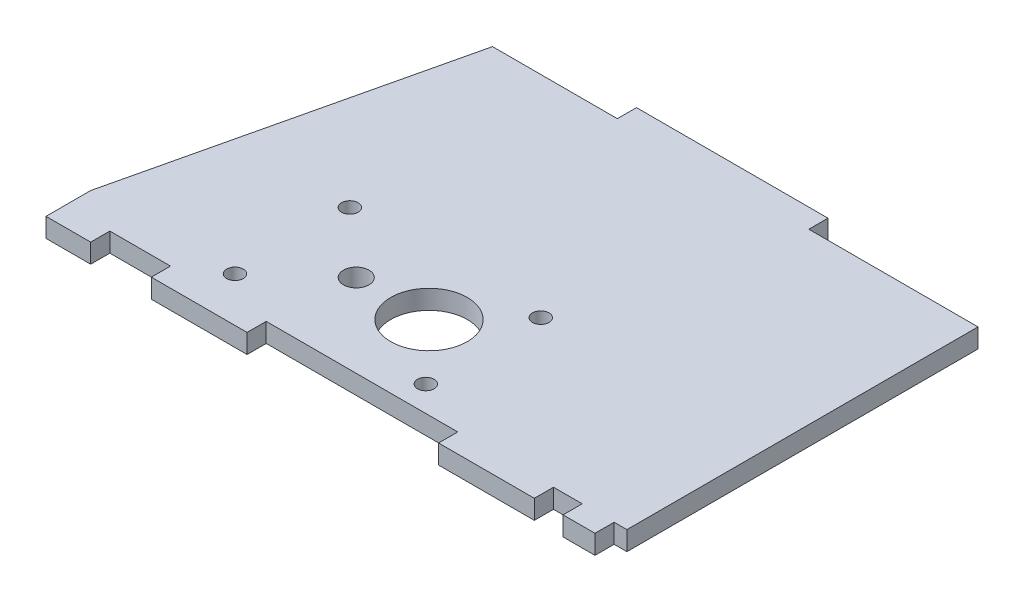
ISO-10303-21;
HEADER;
FILE_DESCRIPTION(('STEP AP214'),'2;1');
FILE_NAME('part.step','',(''),(''),'','','');
FILE_SCHEMA(('AUTOMOTIVE_DESIGN { 1 0 10303 214 1 1 1 1 }'));
ENDSEC;
DATA;
#1=APPLICATION_CONTEXT('core data for automotive mechanical design processes');
#2=APPLICATION_PROTOCOL_DEFINITION('international standard','automotive_design',2000,#1);
#3=PRODUCT_CONTEXT('',#1,'mechanical');
#4=PRODUCT('Part','Part','',(#3));
#5=PRODUCT_RELATED_PRODUCT_CATEGORY('part','',(#4));
#6=PRODUCT_DEFINITION_FORMATION('','',#4);
#7=PRODUCT_DEFINITION_CONTEXT('part definition',#1,'design');
#8=PRODUCT_DEFINITION('design','',#6,#7);
#9=PRODUCT_DEFINITION_SHAPE('','',#8);
#10=(LENGTH_UNIT() NAMED_UNIT(*) SI_UNIT(.MILLI.,.METRE.));
#11=(NAMED_UNIT(*) PLANE_ANGLE_UNIT() SI_UNIT($,.RADIAN.));
#12=(NAMED_UNIT(*) SI_UNIT($,.STERADIAN.) SOLID_ANGLE_UNIT());
#13=UNCERTAINTY_MEASURE_WITH_UNIT(LENGTH_MEASURE(1.E-05),#10,'distance_accuracy_value','');
#14=(GEOMETRIC_REPRESENTATION_CONTEXT(3) GLOBAL_UNCERTAINTY_ASSIGNED_CONTEXT((#13)) GLOBAL_UNIT_ASSIGNED_CONTEXT((#10,
#11,#12)) REPRESENTATION_CONTEXT('',''));
#15=CARTESIAN_POINT('',(0.,0.,0.));
#16=DIRECTION('',(0.,0.,1.));
#17=DIRECTION('',(1.,0.,0.));
#18=AXIS2_PLACEMENT_3D('',#15,#16,#17);
#19=CARTESIAN_POINT('',(0.,3.,0.));
#20=DIRECTION('',(0.,1.,0.));
#21=DIRECTION('',(0.,0.,1.));
#22=AXIS2_PLACEMENT_3D('',#19,#20,#21);
#23=PLANE('',#22);
#24=CARTESIAN_POINT('',(-59.4833722709216,3.,23.2323489280672));
#25=DIRECTION('',(0.,1.,0.));
#26=DIRECTION('',(0.,0.,1.));
#27=AXIS2_PLACEMENT_3D('',#24,#25,#26);
#28=CIRCLE('',#27,1.3);
#29=CARTESIAN_POINT('',(-59.4833722709216,3.,24.5323489280672));
#30=VERTEX_POINT('',#29);
#31=EDGE_CURVE('E518',#30,#30,#28,.T.);
#32=ORIENTED_EDGE('',*,*,#31,.F.);
#33=EDGE_LOOP('',(#32));
#34=FACE_BOUND('',#33,.T.);
#35=CARTESIAN_POINT('',(-67.9833722709216,3.,14.2323489280672));
#36=DIRECTION('',(0.,1.,0.));
#37=DIRECTION('',(0.,0.,1.));
#38=AXIS2_PLACEMENT_3D('',#35,#36,#37);
#39=CIRCLE('',#38,6.);
#40=CARTESIAN_POINT('',(-67.9833722709216,3.,20.2323489280672));
#41=VERTEX_POINT('',#40);
#42=EDGE_CURVE('E534',#41,#41,#39,.T.);
#43=ORIENTED_EDGE('',*,*,#42,.F.);
#44=EDGE_LOOP('',(#43));
#45=FACE_BOUND('',#44,.T.);
#46=CARTESIAN_POINT('',(-59.4833722709216,3.,5.23234892806724));
#47=DIRECTION('',(0.,1.,0.));
#48=DIRECTION('',(0.,0.,1.));
#49=AXIS2_PLACEMENT_3D('',#46,#47,#48);
#50=CIRCLE('',#49,1.3);
#51=CARTESIAN_POINT('',(-59.4833722709216,3.,6.53234892806725));
#52=VERTEX_POINT('',#51);
#53=EDGE_CURVE('E236',#52,#52,#50,.T.);
#54=ORIENTED_EDGE('',*,*,#53,.F.);
#55=EDGE_LOOP('',(#54));
#56=FACE_BOUND('',#55,.T.);
#57=DIRECTION('',(0.,0.,1.));
#58=VECTOR('',#57,1.);
#59=CARTESIAN_POINT('',(-95.4833722709216,3.,27.2323489280672));
#60=LINE('',#59,#58);
#61=CARTESIAN_POINT('',(-95.4833722709216,3.,27.2323489280672));
#62=VERTEX_POINT('',#61);
#63=CARTESIAN_POINT('',(-95.4833722709216,3.,30.2323489280672));
#64=VERTEX_POINT('',#63);
#65=EDGE_CURVE('E302',#62,#64,#60,.T.);
#66=ORIENTED_EDGE('',*,*,#65,.T.);
#67=DIRECTION('',(1.,0.,0.));
#68=VECTOR('',#67,1.);
#69=CARTESIAN_POINT('',(-95.4833722709216,3.,30.2323489280672));
#70=LINE('',#69,#68);
#71=CARTESIAN_POINT('',(-80.4833722709216,3.,30.2323489280672));
#72=VERTEX_POINT('',#71);
#73=EDGE_CURVE('E145',#64,#72,#70,.T.);
#74=ORIENTED_EDGE('',*,*,#73,.T.);
#75=DIRECTION('',(0.,0.,-1.));
#76=VECTOR('',#75,1.);
#77=CARTESIAN_POINT('',(-80.4833722709216,3.,30.2323489280672));
#78=LINE('',#77,#76);
#79=CARTESIAN_POINT('',(-80.4833722709216,3.,27.2323489280672));
#80=VERTEX_POINT('',#79);
#81=EDGE_CURVE('E383',#72,#80,#78,.T.);
#82=ORIENTED_EDGE('',*,*,#81,.T.);
#83=DIRECTION('',(1.,0.,0.));
#84=VECTOR('',#83,1.);
#85=CARTESIAN_POINT('',(-80.4833722709216,3.,27.2323489280672));
#86=LINE('',#85,#84);
#87=CARTESIAN_POINT('',(-50.4833722709216,3.,27.2323489280672));
#88=VERTEX_POINT('',#87);
#89=EDGE_CURVE('E403',#80,#88,#86,.T.);
#90=ORIENTED_EDGE('',*,*,#89,.T.);
#91=DIRECTION('',(0.,0.,1.));
#92=VECTOR('',#91,1.);
#93=CARTESIAN_POINT('',(-50.4833722709216,3.,30.2323489280672));
#94=LINE('',#93,#92);
#95=CARTESIAN_POINT('',(-50.4833722709216,3.,30.2323489280672));
#96=VERTEX_POINT('',#95);
#97=EDGE_CURVE('E399',#88,#96,#94,.T.);
#98=ORIENTED_EDGE('',*,*,#97,.T.);
#99=DIRECTION('',(1.,0.,0.));
#100=VECTOR('',#99,1.);
#101=CARTESIAN_POINT('',(-35.4833722709216,3.,30.2323489280672));
#102=LINE('',#101,#100);
#103=CARTESIAN_POINT('',(-35.4833722709216,3.,30.2323489280672));
#104=VERTEX_POINT('',#103);
#105=EDGE_CURVE('E402',#96,#104,#102,.T.);
#106=ORIENTED_EDGE('',*,*,#105,.T.);
#107=DIRECTION('',(0.,0.,-1.));
#108=VECTOR('',#107,1.);
#109=CARTESIAN_POINT('',(-35.4833722709216,3.,30.2323489280672));
#110=LINE('',#109,#108);
#111=CARTESIAN_POINT('',(-35.4833722709216,3.,27.2323489280672));
#112=VERTEX_POINT('',#111);
#113=EDGE_CURVE('E407',#104,#112,#110,.T.);
#114=ORIENTED_EDGE('',*,*,#113,.T.);
#115=DIRECTION('',(1.,0.,0.));
#116=VECTOR('',#115,1.);
#117=CARTESIAN_POINT('',(-35.4833722709216,3.,27.2323489280672));
#118=LINE('',#117,#116);
#119=CARTESIAN_POINT('',(-30.9833722709216,3.,27.2323489280672));
#120=VERTEX_POINT('',#119);
#121=EDGE_CURVE('E414',#112,#120,#118,.T.);
#122=ORIENTED_EDGE('',*,*,#121,.T.);
#123=DIRECTION('',(0.,0.,1.));
#124=VECTOR('',#123,1.);
#125=CARTESIAN_POINT('',(-30.9833722709216,3.,27.2323489280672));
#126=LINE('',#125,#124);
#127=CARTESIAN_POINT('',(-30.9833722709216,3.,30.2323489280672));
#128=VERTEX_POINT('',#127);
#129=EDGE_CURVE('E417',#120,#128,#126,.T.);
#130=ORIENTED_EDGE('',*,*,#129,.T.);
#131=DIRECTION('',(1.,0.,0.));
#132=VECTOR('',#131,1.);
#133=CARTESIAN_POINT('',(-30.9833722709216,3.,30.2323489280672));
#134=LINE('',#133,#132);
#135=CARTESIAN_POINT('',(-25.9833722709216,3.,30.2323489280672));
#136=VERTEX_POINT('',#135);
#137=EDGE_CURVE('E420',#128,#136,#134,.T.);
#138=ORIENTED_EDGE('',*,*,#137,.T.);
#139=DIRECTION('',(0.,0.,-1.));
#140=VECTOR('',#139,1.);
#141=CARTESIAN_POINT('',(-25.9833722709216,3.,30.2323489280672));
#142=LINE('',#141,#140);
#143=CARTESIAN_POINT('',(-25.9833722709216,3.,27.2323489280672));
#144=VERTEX_POINT('',#143);
#145=EDGE_CURVE('E423',#136,#144,#142,.T.);
#146=ORIENTED_EDGE('',*,*,#145,.T.);
#147=DIRECTION('',(1.,0.,0.));
#148=VECTOR('',#147,1.);
#149=CARTESIAN_POINT('',(-25.9833722709216,3.,27.2323489280672));
#150=LINE('',#149,#148);
#151=CARTESIAN_POINT('',(-23.9833722709216,3.,27.2323489280672));
#152=VERTEX_POINT('',#151);
#153=EDGE_CURVE('E426',#144,#152,#150,.T.);
#154=ORIENTED_EDGE('',*,*,#153,.T.);
#155=DIRECTION('',(0.,0.,-1.));
#156=VECTOR('',#155,1.);
#157=CARTESIAN_POINT('',(-23.9833722709216,3.,27.2323489280672));
#158=LINE('',#157,#156);
#159=CARTESIAN_POINT('',(-23.9833722709216,3.,-27.7676510719328));
#160=VERTEX_POINT('',#159);
#161=EDGE_CURVE('E429',#152,#160,#158,.T.);
#162=ORIENTED_EDGE('',*,*,#161,.T.);
#163=DIRECTION('',(-1.,0.,0.));
#164=VECTOR('',#163,1.);
#165=CARTESIAN_POINT('',(-23.9833722709216,3.,-27.7676510719328));
#166=LINE('',#165,#164);
#167=CARTESIAN_POINT('',(-50.4833722709216,3.,-27.7676510719328));
#168=VERTEX_POINT('',#167);
#169=EDGE_CURVE('E432',#160,#168,#166,.T.);
#170=ORIENTED_EDGE('',*,*,#169,.T.);
#171=DIRECTION('',(0.,0.,-1.));
#172=VECTOR('',#171,1.);
#173=CARTESIAN_POINT('',(-50.4833722709216,3.,-27.7676510719328));
#174=LINE('',#173,#172);
#175=CARTESIAN_POINT('',(-50.4833722709216,3.,-30.7676510719328));
#176=VERTEX_POINT('',#175);
#177=EDGE_CURVE('E435',#168,#176,#174,.T.);
#178=ORIENTED_EDGE('',*,*,#177,.T.);
#179=DIRECTION('',(-1.,0.,0.));
#180=VECTOR('',#179,1.);
#181=CARTESIAN_POINT('',(-80.4833722709216,3.,-30.7676510719328));
#182=LINE('',#181,#180);
#183=CARTESIAN_POINT('',(-80.4833722709216,3.,-30.7676510719328));
#184=VERTEX_POINT('',#183);
#185=EDGE_CURVE('E438',#176,#184,#182,.T.);
#186=ORIENTED_EDGE('',*,*,#185,.T.);
#187=DIRECTION('',(0.,0.,1.));
#188=VECTOR('',#187,1.);
#189=CARTESIAN_POINT('',(-80.4833722709216,3.,-27.7676510719328));
#190=LINE('',#189,#188);
#191=CARTESIAN_POINT('',(-80.4833722709216,3.,-27.7676510719328));
#192=VERTEX_POINT('',#191);
#193=EDGE_CURVE('E441',#184,#192,#190,.T.);
#194=ORIENTED_EDGE('',*,*,#193,.T.);
#195=DIRECTION('',(-1.,0.,0.));
#196=VECTOR('',#195,1.);
#197=CARTESIAN_POINT('',(-95.4833722709216,3.,-27.7676510719328));
#198=LINE('',#197,#196);
#199=CARTESIAN_POINT('',(-100.033372270922,3.,-27.7676510719328));
#200=VERTEX_POINT('',#199);
#201=EDGE_CURVE('E444',#192,#200,#198,.T.);
#202=ORIENTED_EDGE('',*,*,#201,.T.);
#203=DIRECTION('',(-0.228134770233683,0.,0.973629563340404));
#204=VECTOR('',#203,1.);
#205=CARTESIAN_POINT('',(-100.033372270922,3.,-27.7676510719328));
#206=LINE('',#205,#204);
#207=CARTESIAN_POINT('',(-111.983372270922,3.,23.2323489280672));
#208=VERTEX_POINT('',#207);
#209=EDGE_CURVE('E447',#200,#208,#206,.T.);
#210=ORIENTED_EDGE('',*,*,#209,.T.);
#211=DIRECTION('',(0.,0.,1.));
#212=VECTOR('',#211,1.);
#213=CARTESIAN_POINT('',(-111.983372270922,3.,27.2323489280672));
#214=LINE('',#213,#212);
#215=CARTESIAN_POINT('',(-111.983372270922,3.,30.2323489280672));
#216=VERTEX_POINT('',#215);
#217=EDGE_CURVE('E209',#208,#216,#214,.T.);
#218=ORIENTED_EDGE('',*,*,#217,.T.);
#219=DIRECTION('',(1.,0.,0.));
#220=VECTOR('',#219,1.);
#221=CARTESIAN_POINT('',(-111.983372270922,3.,30.2323489280672));
#222=LINE('',#221,#220);
#223=CARTESIAN_POINT('',(-104.983372270922,3.,30.2323489280672));
#224=VERTEX_POINT('',#223);
#225=EDGE_CURVE('E203',#216,#224,#222,.T.);
#226=ORIENTED_EDGE('',*,*,#225,.T.);
#227=DIRECTION('',(0.,0.,-1.));
#228=VECTOR('',#227,1.);
#229=CARTESIAN_POINT('',(-104.983372270922,3.,30.2323489280672));
#230=LINE('',#229,#228);
#231=CARTESIAN_POINT('',(-104.983372270922,3.,27.2323489280672));
#232=VERTEX_POINT('',#231);
#233=EDGE_CURVE('E207',#224,#232,#230,.T.);
#234=ORIENTED_EDGE('',*,*,#233,.T.);
#235=DIRECTION('',(1.,0.,0.));
#236=VECTOR('',#235,1.);
#237=CARTESIAN_POINT('',(-104.983372270922,3.,27.2323489280672));
#238=LINE('',#237,#236);
#239=EDGE_CURVE('E57',#232,#62,#238,.T.);
#240=ORIENTED_EDGE('',*,*,#239,.T.);
#241=EDGE_LOOP('',(#66,#74,#82,#90,#98,#106,#114,#122,#130,#138,#146,#154,#162,#170,#178,#186,
#194,#202,#210,#218,#226,#234,#240));
#242=FACE_BOUND('',#241,.T.);
#243=CARTESIAN_POINT('',(-79.3833722709216,3.,14.2323489280672));
#244=DIRECTION('',(0.,1.,0.));
#245=DIRECTION('',(0.,0.,1.));
#246=AXIS2_PLACEMENT_3D('',#243,#244,#245);
#247=CIRCLE('',#246,2.);
#248=CARTESIAN_POINT('',(-79.3833722709216,3.,16.2323489280672));
#249=VERTEX_POINT('',#248);
#250=EDGE_CURVE('E542',#249,#249,#247,.T.);
#251=ORIENTED_EDGE('',*,*,#250,.F.);
#252=EDGE_LOOP('',(#251));
#253=FACE_BOUND('',#252,.T.);
#254=CARTESIAN_POINT('',(-89.3833722709216,3.,5.23234892806725));
#255=DIRECTION('',(0.,1.,0.));
#256=DIRECTION('',(0.,0.,1.));
#257=AXIS2_PLACEMENT_3D('',#254,#255,#256);
#258=CIRCLE('',#257,1.29999999999999);
#259=CARTESIAN_POINT('',(-89.3833722709216,3.,6.53234892806724));
#260=VERTEX_POINT('',#259);
#261=EDGE_CURVE('E526',#260,#260,#258,.T.);
#262=ORIENTED_EDGE('',*,*,#261,.F.);
#263=EDGE_LOOP('',(#262));
#264=FACE_BOUND('',#263,.T.);
#265=CARTESIAN_POINT('',(-89.3833722709216,3.,23.2323489280672));
#266=DIRECTION('',(0.,1.,0.));
#267=DIRECTION('',(0.,0.,1.));
#268=AXIS2_PLACEMENT_3D('',#265,#266,#267);
#269=CIRCLE('',#268,1.29999999999999);
#270=CARTESIAN_POINT('',(-89.3833722709216,3.,24.5323489280672));
#271=VERTEX_POINT('',#270);
#272=EDGE_CURVE('E507',#271,#271,#269,.T.);
#273=ORIENTED_EDGE('',*,*,#272,.F.);
#274=EDGE_LOOP('',(#273));
#275=FACE_BOUND('',#274,.T.);
#276=ADVANCED_FACE('F39',(#34,#45,#56,#242,#253,#264,#275),#23,.T.);
#277=CARTESIAN_POINT('',(0.,0.,0.));
#278=DIRECTION('',(0.,1.,0.));
#279=DIRECTION('',(0.,0.,1.));
#280=AXIS2_PLACEMENT_3D('',#277,#278,#279);
#281=PLANE('',#280);
#282=DIRECTION('',(0.,0.,1.));
#283=VECTOR('',#282,1.);
#284=CARTESIAN_POINT('',(-95.4833722709216,0.,27.2323489280672));
#285=LINE('',#284,#283);
#286=CARTESIAN_POINT('',(-95.4833722709216,0.,27.2323489280672));
#287=VERTEX_POINT('',#286);
#288=CARTESIAN_POINT('',(-95.4833722709216,0.,30.2323489280672));
#289=VERTEX_POINT('',#288);
#290=EDGE_CURVE('E231',#287,#289,#285,.T.);
#291=ORIENTED_EDGE('',*,*,#290,.F.);
#292=DIRECTION('',(1.,0.,0.));
#293=VECTOR('',#292,1.);
#294=CARTESIAN_POINT('',(-104.983372270922,0.,27.2323489280672));
#295=LINE('',#294,#293);
#296=CARTESIAN_POINT('',(-104.983372270922,0.,27.2323489280672));
#297=VERTEX_POINT('',#296);
#298=EDGE_CURVE('E137',#297,#287,#295,.T.);
#299=ORIENTED_EDGE('',*,*,#298,.F.);
#300=DIRECTION('',(0.,0.,-1.));
#301=VECTOR('',#300,1.);
#302=CARTESIAN_POINT('',(-104.983372270922,0.,30.2323489280672));
#303=LINE('',#302,#301);
#304=CARTESIAN_POINT('',(-104.983372270922,0.,30.2323489280672));
#305=VERTEX_POINT('',#304);
#306=EDGE_CURVE('E131',#305,#297,#303,.T.);
#307=ORIENTED_EDGE('',*,*,#306,.F.);
#308=DIRECTION('',(1.,0.,0.));
#309=VECTOR('',#308,1.);
#310=CARTESIAN_POINT('',(-111.983372270922,0.,30.2323489280672));
#311=LINE('',#310,#309);
#312=CARTESIAN_POINT('',(-111.983372270922,0.,30.2323489280672));
#313=VERTEX_POINT('',#312);
#314=EDGE_CURVE('E218',#313,#305,#311,.T.);
#315=ORIENTED_EDGE('',*,*,#314,.F.);
#316=DIRECTION('',(0.,0.,1.));
#317=VECTOR('',#316,1.);
#318=CARTESIAN_POINT('',(-111.983372270922,0.,27.2323489280672));
#319=LINE('',#318,#317);
#320=CARTESIAN_POINT('',(-111.983372270922,0.,23.2323489280672));
#321=VERTEX_POINT('',#320);
#322=EDGE_CURVE('E293',#321,#313,#319,.T.);
#323=ORIENTED_EDGE('',*,*,#322,.F.);
#324=DIRECTION('',(-0.228134770233683,0.,0.973629563340404));
#325=VECTOR('',#324,1.);
#326=CARTESIAN_POINT('',(-100.033372270922,0.,-27.7676510719328));
#327=LINE('',#326,#325);
#328=CARTESIAN_POINT('',(-100.033372270922,0.,-27.7676510719328));
#329=VERTEX_POINT('',#328);
#330=EDGE_CURVE('E289',#329,#321,#327,.T.);
#331=ORIENTED_EDGE('',*,*,#330,.F.);
#332=DIRECTION('',(-1.,0.,0.));
#333=VECTOR('',#332,1.);
#334=CARTESIAN_POINT('',(-95.4833722709216,0.,-27.7676510719328));
#335=LINE('',#334,#333);
#336=CARTESIAN_POINT('',(-80.4833722709216,0.,-27.7676510719328));
#337=VERTEX_POINT('',#336);
#338=EDGE_CURVE('E286',#337,#329,#335,.T.);
#339=ORIENTED_EDGE('',*,*,#338,.F.);
#340=DIRECTION('',(0.,0.,1.));
#341=VECTOR('',#340,1.);
#342=CARTESIAN_POINT('',(-80.4833722709216,0.,-27.7676510719328));
#343=LINE('',#342,#341);
#344=CARTESIAN_POINT('',(-80.4833722709216,0.,-30.7676510719328));
#345=VERTEX_POINT('',#344);
#346=EDGE_CURVE('E282',#345,#337,#343,.T.);
#347=ORIENTED_EDGE('',*,*,#346,.F.);
#348=DIRECTION('',(-1.,0.,0.));
#349=VECTOR('',#348,1.);
#350=CARTESIAN_POINT('',(-80.4833722709216,0.,-30.7676510719328));
#351=LINE('',#350,#349);
#352=CARTESIAN_POINT('',(-50.4833722709216,0.,-30.7676510719328));
#353=VERTEX_POINT('',#352);
#354=EDGE_CURVE('E279',#353,#345,#351,.T.);
#355=ORIENTED_EDGE('',*,*,#354,.F.);
#356=DIRECTION('',(0.,0.,-1.));
#357=VECTOR('',#356,1.);
#358=CARTESIAN_POINT('',(-50.4833722709216,0.,-27.7676510719328));
#359=LINE('',#358,#357);
#360=CARTESIAN_POINT('',(-50.4833722709216,0.,-27.7676510719328));
#361=VERTEX_POINT('',#360);
#362=EDGE_CURVE('E276',#361,#353,#359,.T.);
#363=ORIENTED_EDGE('',*,*,#362,.F.);
#364=DIRECTION('',(-1.,0.,0.));
#365=VECTOR('',#364,1.);
#366=CARTESIAN_POINT('',(-35.4833722709216,0.,-27.7676510719328));
#367=LINE('',#366,#365);
#368=CARTESIAN_POINT('',(-23.9833722709216,0.,-27.7676510719328));
#369=VERTEX_POINT('',#368);
#370=EDGE_CURVE('E273',#369,#361,#367,.T.);
#371=ORIENTED_EDGE('',*,*,#370,.F.);
#372=DIRECTION('',(0.,0.,-1.));
#373=VECTOR('',#372,1.);
#374=CARTESIAN_POINT('',(-23.9833722709216,0.,27.2323489280672));
#375=LINE('',#374,#373);
#376=CARTESIAN_POINT('',(-23.9833722709216,0.,27.2323489280672));
#377=VERTEX_POINT('',#376);
#378=EDGE_CURVE('E269',#377,#369,#375,.T.);
#379=ORIENTED_EDGE('',*,*,#378,.F.);
#380=DIRECTION('',(1.,0.,0.));
#381=VECTOR('',#380,1.);
#382=CARTESIAN_POINT('',(-25.9833722709216,0.,27.2323489280672));
#383=LINE('',#382,#381);
#384=CARTESIAN_POINT('',(-25.9833722709216,0.,27.2323489280672));
#385=VERTEX_POINT('',#384);
#386=EDGE_CURVE('E266',#385,#377,#383,.T.);
#387=ORIENTED_EDGE('',*,*,#386,.F.);
#388=DIRECTION('',(0.,0.,-1.));
#389=VECTOR('',#388,1.);
#390=CARTESIAN_POINT('',(-25.9833722709216,0.,30.2323489280672));
#391=LINE('',#390,#389);
#392=CARTESIAN_POINT('',(-25.9833722709216,0.,30.2323489280672));
#393=VERTEX_POINT('',#392);
#394=EDGE_CURVE('E263',#393,#385,#391,.T.);
#395=ORIENTED_EDGE('',*,*,#394,.F.);
#396=DIRECTION('',(1.,0.,0.));
#397=VECTOR('',#396,1.);
#398=CARTESIAN_POINT('',(-30.9833722709216,0.,30.2323489280672));
#399=LINE('',#398,#397);
#400=CARTESIAN_POINT('',(-30.9833722709216,0.,30.2323489280672));
#401=VERTEX_POINT('',#400);
#402=EDGE_CURVE('E260',#401,#393,#399,.T.);
#403=ORIENTED_EDGE('',*,*,#402,.F.);
#404=DIRECTION('',(0.,0.,1.));
#405=VECTOR('',#404,1.);
#406=CARTESIAN_POINT('',(-30.9833722709216,0.,27.2323489280672));
#407=LINE('',#406,#405);
#408=CARTESIAN_POINT('',(-30.9833722709216,0.,27.2323489280672));
#409=VERTEX_POINT('',#408);
#410=EDGE_CURVE('E257',#409,#401,#407,.T.);
#411=ORIENTED_EDGE('',*,*,#410,.F.);
#412=DIRECTION('',(1.,0.,0.));
#413=VECTOR('',#412,1.);
#414=CARTESIAN_POINT('',(-35.4833722709216,0.,27.2323489280672));
#415=LINE('',#414,#413);
#416=CARTESIAN_POINT('',(-35.4833722709216,0.,27.2323489280672));
#417=VERTEX_POINT('',#416);
#418=EDGE_CURVE('E254',#417,#409,#415,.T.);
#419=ORIENTED_EDGE('',*,*,#418,.F.);
#420=DIRECTION('',(0.,0.,-1.));
#421=VECTOR('',#420,1.);
#422=CARTESIAN_POINT('',(-35.4833722709216,0.,30.2323489280672));
#423=LINE('',#422,#421);
#424=CARTESIAN_POINT('',(-35.4833722709216,0.,30.2323489280672));
#425=VERTEX_POINT('',#424);
#426=EDGE_CURVE('E251',#425,#417,#423,.T.);
#427=ORIENTED_EDGE('',*,*,#426,.F.);
#428=DIRECTION('',(1.,0.,0.));
#429=VECTOR('',#428,1.);
#430=CARTESIAN_POINT('',(-35.4833722709216,0.,30.2323489280672));
#431=LINE('',#430,#429);
#432=CARTESIAN_POINT('',(-50.4833722709216,0.,30.2323489280672));
#433=VERTEX_POINT('',#432);
#434=EDGE_CURVE('E248',#433,#425,#431,.T.);
#435=ORIENTED_EDGE('',*,*,#434,.F.);
#436=DIRECTION('',(0.,0.,1.));
#437=VECTOR('',#436,1.);
#438=CARTESIAN_POINT('',(-50.4833722709216,0.,30.2323489280672));
#439=LINE('',#438,#437);
#440=CARTESIAN_POINT('',(-50.4833722709216,0.,27.2323489280672));
#441=VERTEX_POINT('',#440);
#442=EDGE_CURVE('E245',#441,#433,#439,.T.);
#443=ORIENTED_EDGE('',*,*,#442,.F.);
#444=DIRECTION('',(1.,0.,0.));
#445=VECTOR('',#444,1.);
#446=CARTESIAN_POINT('',(-80.4833722709216,0.,27.2323489280672));
#447=LINE('',#446,#445);
#448=CARTESIAN_POINT('',(-80.4833722709216,0.,27.2323489280672));
#449=VERTEX_POINT('',#448);
#450=EDGE_CURVE('E242',#449,#441,#447,.T.);
#451=ORIENTED_EDGE('',*,*,#450,.F.);
#452=DIRECTION('',(0.,0.,-1.));
#453=VECTOR('',#452,1.);
#454=CARTESIAN_POINT('',(-80.4833722709216,0.,30.2323489280672));
#455=LINE('',#454,#453);
#456=CARTESIAN_POINT('',(-80.4833722709216,0.,30.2323489280672));
#457=VERTEX_POINT('',#456);
#458=EDGE_CURVE('E239',#457,#449,#455,.T.);
#459=ORIENTED_EDGE('',*,*,#458,.F.);
#460=DIRECTION('',(1.,0.,0.));
#461=VECTOR('',#460,1.);
#462=CARTESIAN_POINT('',(-95.4833722709216,0.,30.2323489280672));
#463=LINE('',#462,#461);
#464=EDGE_CURVE('E235',#289,#457,#463,.T.);
#465=ORIENTED_EDGE('',*,*,#464,.F.);
#466=EDGE_LOOP('',(#291,#299,#307,#315,#323,#331,#339,#347,#355,#363,#371,#379,#387,#395,#403,
#411,#419,#427,#435,#443,#451,#459,#465));
#467=FACE_BOUND('',#466,.T.);
#468=CARTESIAN_POINT('',(-59.4833722709216,0.,5.23234892806724));
#469=DIRECTION('',(0.,1.,0.));
#470=DIRECTION('',(0.,0.,1.));
#471=AXIS2_PLACEMENT_3D('',#468,#469,#470);
#472=CIRCLE('',#471,1.3);
#473=CARTESIAN_POINT('',(-59.4833722709216,0.,6.53234892806725));
#474=VERTEX_POINT('',#473);
#475=EDGE_CURVE('E546',#474,#474,#472,.T.);
#476=ORIENTED_EDGE('',*,*,#475,.T.);
#477=EDGE_LOOP('',(#476));
#478=FACE_BOUND('',#477,.T.);
#479=CARTESIAN_POINT('',(-79.3833722709216,0.,14.2323489280672));
#480=DIRECTION('',(0.,1.,0.));
#481=DIRECTION('',(0.,0.,1.));
#482=AXIS2_PLACEMENT_3D('',#479,#480,#481);
#483=CIRCLE('',#482,2.);
#484=CARTESIAN_POINT('',(-79.3833722709216,0.,16.2323489280672));
#485=VERTEX_POINT('',#484);
#486=EDGE_CURVE('E538',#485,#485,#483,.T.);
#487=ORIENTED_EDGE('',*,*,#486,.T.);
#488=EDGE_LOOP('',(#487));
#489=FACE_BOUND('',#488,.T.);
#490=CARTESIAN_POINT('',(-67.9833722709216,0.,14.2323489280672));
#491=DIRECTION('',(0.,1.,0.));
#492=DIRECTION('',(0.,0.,1.));
#493=AXIS2_PLACEMENT_3D('',#490,#491,#492);
#494=CIRCLE('',#493,6.);
#495=CARTESIAN_POINT('',(-67.9833722709216,0.,20.2323489280672));
#496=VERTEX_POINT('',#495);
#497=EDGE_CURVE('E530',#496,#496,#494,.T.);
#498=ORIENTED_EDGE('',*,*,#497,.T.);
#499=EDGE_LOOP('',(#498));
#500=FACE_BOUND('',#499,.T.);
#501=CARTESIAN_POINT('',(-89.3833722709216,0.,5.23234892806725));
#502=DIRECTION('',(0.,1.,0.));
#503=DIRECTION('',(0.,0.,1.));
#504=AXIS2_PLACEMENT_3D('',#501,#502,#503);
#505=CIRCLE('',#504,1.29999999999999);
#506=CARTESIAN_POINT('',(-89.3833722709216,0.,6.53234892806724));
#507=VERTEX_POINT('',#506);
#508=EDGE_CURVE('E522',#507,#507,#505,.T.);
#509=ORIENTED_EDGE('',*,*,#508,.T.);
#510=EDGE_LOOP('',(#509));
#511=FACE_BOUND('',#510,.T.);
#512=CARTESIAN_POINT('',(-59.4833722709216,0.,23.2323489280672));
#513=DIRECTION('',(0.,1.,0.));
#514=DIRECTION('',(0.,0.,1.));
#515=AXIS2_PLACEMENT_3D('',#512,#513,#514);
#516=CIRCLE('',#515,1.3);
#517=CARTESIAN_POINT('',(-59.4833722709216,0.,24.5323489280672));
#518=VERTEX_POINT('',#517);
#519=EDGE_CURVE('E515',#518,#518,#516,.T.);
#520=ORIENTED_EDGE('',*,*,#519,.T.);
#521=EDGE_LOOP('',(#520));
#522=FACE_BOUND('',#521,.T.);
#523=CARTESIAN_POINT('',(-89.3833722709216,0.,23.2323489280672));
#524=DIRECTION('',(0.,1.,0.));
#525=DIRECTION('',(0.,0.,1.));
#526=AXIS2_PLACEMENT_3D('',#523,#524,#525);
#527=CIRCLE('',#526,1.29999999999999);
#528=CARTESIAN_POINT('',(-89.3833722709216,0.,24.5323489280672));
#529=VERTEX_POINT('',#528);
#530=EDGE_CURVE('E510',#529,#529,#527,.T.);
#531=ORIENTED_EDGE('',*,*,#530,.T.);
#532=EDGE_LOOP('',(#531));
#533=FACE_BOUND('',#532,.T.);
#534=ADVANCED_FACE('F387',(#467,#478,#489,#500,#511,#522,#533),#281,.F.);
#535=CARTESIAN_POINT('',(-95.4833722709216,3.,27.2323489280672));
#536=DIRECTION('',(1.,0.,0.));
#537=DIRECTION('',(0.,0.,-1.));
#538=AXIS2_PLACEMENT_3D('',#535,#536,#537);
#539=PLANE('',#538);
#540=ORIENTED_EDGE('',*,*,#290,.T.);
#541=DIRECTION('',(0.,-1.,0.));
#542=VECTOR('',#541,1.);
#543=CARTESIAN_POINT('',(-95.4833722709216,3.,30.2323489280672));
#544=LINE('',#543,#542);
#545=EDGE_CURVE('E11',#64,#289,#544,.T.);
#546=ORIENTED_EDGE('',*,*,#545,.F.);
#547=ORIENTED_EDGE('',*,*,#65,.F.);
#548=DIRECTION('',(0.,-1.,0.));
#549=VECTOR('',#548,1.);
#550=CARTESIAN_POINT('',(-95.4833722709216,3.,27.2323489280672));
#551=LINE('',#550,#549);
#552=EDGE_CURVE('E227',#62,#287,#551,.T.);
#553=ORIENTED_EDGE('',*,*,#552,.T.);
#554=EDGE_LOOP('',(#540,#546,#547,#553));
#555=FACE_BOUND('',#554,.T.);
#556=ADVANCED_FACE('F41',(#555),#539,.F.);
#557=CARTESIAN_POINT('',(-95.4833722709216,3.,30.2323489280672));
#558=DIRECTION('',(0.,0.,-1.));
#559=DIRECTION('',(-1.,0.,0.));
#560=AXIS2_PLACEMENT_3D('',#557,#558,#559);
#561=PLANE('',#560);
#562=ORIENTED_EDGE('',*,*,#464,.T.);
#563=DIRECTION('',(0.,-1.,0.));
#564=VECTOR('',#563,1.);
#565=CARTESIAN_POINT('',(-80.4833722709216,3.,30.2323489280672));
#566=LINE('',#565,#564);
#567=EDGE_CURVE('E49',#72,#457,#566,.T.);
#568=ORIENTED_EDGE('',*,*,#567,.F.);
#569=ORIENTED_EDGE('',*,*,#73,.F.);
#570=ORIENTED_EDGE('',*,*,#545,.T.);
#571=EDGE_LOOP('',(#562,#568,#569,#570));
#572=FACE_BOUND('',#571,.T.);
#573=ADVANCED_FACE('F794',(#572),#561,.F.);
#574=CARTESIAN_POINT('',(-80.4833722709216,3.,30.2323489280672));
#575=DIRECTION('',(-1.,0.,0.));
#576=DIRECTION('',(0.,0.,1.));
#577=AXIS2_PLACEMENT_3D('',#574,#575,#576);
#578=PLANE('',#577);
#579=ORIENTED_EDGE('',*,*,#458,.T.);
#580=DIRECTION('',(0.,-1.,0.));
#581=VECTOR('',#580,1.);
#582=CARTESIAN_POINT('',(-80.4833722709216,3.,27.2323489280672));
#583=LINE('',#582,#581);
#584=EDGE_CURVE('E373',#80,#449,#583,.T.);
#585=ORIENTED_EDGE('',*,*,#584,.F.);
#586=ORIENTED_EDGE('',*,*,#81,.F.);
#587=ORIENTED_EDGE('',*,*,#567,.T.);
#588=EDGE_LOOP('',(#579,#585,#586,#587));
#589=FACE_BOUND('',#588,.T.);
#590=ADVANCED_FACE('F381',(#589),#578,.F.);
#591=CARTESIAN_POINT('',(-80.4833722709216,3.,27.2323489280672));
#592=DIRECTION('',(0.,0.,-1.));
#593=DIRECTION('',(-1.,0.,0.));
#594=AXIS2_PLACEMENT_3D('',#591,#592,#593);
#595=PLANE('',#594);
#596=ORIENTED_EDGE('',*,*,#450,.T.);
#597=DIRECTION('',(0.,-1.,0.));
#598=VECTOR('',#597,1.);
#599=CARTESIAN_POINT('',(-50.4833722709216,3.,27.2323489280672));
#600=LINE('',#599,#598);
#601=EDGE_CURVE('E369',#88,#441,#600,.T.);
#602=ORIENTED_EDGE('',*,*,#601,.F.);
#603=ORIENTED_EDGE('',*,*,#89,.F.);
#604=ORIENTED_EDGE('',*,*,#584,.T.);
#605=EDGE_LOOP('',(#596,#602,#603,#604));
#606=FACE_BOUND('',#605,.T.);
#607=ADVANCED_FACE('F393',(#606),#595,.F.);
#608=CARTESIAN_POINT('',(-50.4833722709216,3.,30.2323489280672));
#609=DIRECTION('',(1.,0.,0.));
#610=DIRECTION('',(0.,0.,-1.));
#611=AXIS2_PLACEMENT_3D('',#608,#609,#610);
#612=PLANE('',#611);
#613=ORIENTED_EDGE('',*,*,#442,.T.);
#614=DIRECTION('',(0.,-1.,0.));
#615=VECTOR('',#614,1.);
#616=CARTESIAN_POINT('',(-50.4833722709216,3.,30.2323489280672));
#617=LINE('',#616,#615);
#618=EDGE_CURVE('E365',#96,#433,#617,.T.);
#619=ORIENTED_EDGE('',*,*,#618,.F.);
#620=ORIENTED_EDGE('',*,*,#97,.F.);
#621=ORIENTED_EDGE('',*,*,#601,.T.);
#622=EDGE_LOOP('',(#613,#619,#620,#621));
#623=FACE_BOUND('',#622,.T.);
#624=ADVANCED_FACE('F397',(#623),#612,.F.);
#625=CARTESIAN_POINT('',(-35.4833722709216,3.,30.2323489280672));
#626=DIRECTION('',(0.,0.,-1.));
#627=DIRECTION('',(-1.,0.,0.));
#628=AXIS2_PLACEMENT_3D('',#625,#626,#627);
#629=PLANE('',#628);
#630=ORIENTED_EDGE('',*,*,#434,.T.);
#631=DIRECTION('',(0.,-1.,0.));
#632=VECTOR('',#631,1.);
#633=CARTESIAN_POINT('',(-35.4833722709216,3.,30.2323489280672));
#634=LINE('',#633,#632);
#635=EDGE_CURVE('E361',#104,#425,#634,.T.);
#636=ORIENTED_EDGE('',*,*,#635,.F.);
#637=ORIENTED_EDGE('',*,*,#105,.F.);
#638=ORIENTED_EDGE('',*,*,#618,.T.);
#639=EDGE_LOOP('',(#630,#636,#637,#638));
#640=FACE_BOUND('',#639,.T.);
#641=ADVANCED_FACE('F759',(#640),#629,.F.);
#642=CARTESIAN_POINT('',(-35.4833722709216,3.,30.2323489280672));
#643=DIRECTION('',(-1.,0.,0.));
#644=DIRECTION('',(0.,0.,1.));
#645=AXIS2_PLACEMENT_3D('',#642,#643,#644);
#646=PLANE('',#645);
#647=ORIENTED_EDGE('',*,*,#426,.T.);
#648=DIRECTION('',(0.,-1.,0.));
#649=VECTOR('',#648,1.);
#650=CARTESIAN_POINT('',(-35.4833722709216,3.,27.2323489280672));
#651=LINE('',#650,#649);
#652=EDGE_CURVE('E357',#112,#417,#651,.T.);
#653=ORIENTED_EDGE('',*,*,#652,.F.);
#654=ORIENTED_EDGE('',*,*,#113,.F.);
#655=ORIENTED_EDGE('',*,*,#635,.T.);
#656=EDGE_LOOP('',(#647,#653,#654,#655));
#657=FACE_BOUND('',#656,.T.);
#658=ADVANCED_FACE('F749',(#657),#646,.F.);
#659=CARTESIAN_POINT('',(-35.4833722709216,3.,27.2323489280672));
#660=DIRECTION('',(0.,0.,-1.));
#661=DIRECTION('',(-1.,0.,0.));
#662=AXIS2_PLACEMENT_3D('',#659,#660,#661);
#663=PLANE('',#662);
#664=ORIENTED_EDGE('',*,*,#418,.T.);
#665=DIRECTION('',(0.,-1.,0.));
#666=VECTOR('',#665,1.);
#667=CARTESIAN_POINT('',(-30.9833722709216,3.,27.2323489280672));
#668=LINE('',#667,#666);
#669=EDGE_CURVE('E353',#120,#409,#668,.T.);
#670=ORIENTED_EDGE('',*,*,#669,.F.);
#671=ORIENTED_EDGE('',*,*,#121,.F.);
#672=ORIENTED_EDGE('',*,*,#652,.T.);
#673=EDGE_LOOP('',(#664,#670,#671,#672));
#674=FACE_BOUND('',#673,.T.);
#675=ADVANCED_FACE('F739',(#674),#663,.F.);
#676=CARTESIAN_POINT('',(-30.9833722709216,3.,27.2323489280672));
#677=DIRECTION('',(1.,0.,0.));
#678=DIRECTION('',(0.,0.,-1.));
#679=AXIS2_PLACEMENT_3D('',#676,#677,#678);
#680=PLANE('',#679);
#681=ORIENTED_EDGE('',*,*,#410,.T.);
#682=DIRECTION('',(0.,-1.,0.));
#683=VECTOR('',#682,1.);
#684=CARTESIAN_POINT('',(-30.9833722709216,3.,30.2323489280672));
#685=LINE('',#684,#683);
#686=EDGE_CURVE('E349',#128,#401,#685,.T.);
#687=ORIENTED_EDGE('',*,*,#686,.F.);
#688=ORIENTED_EDGE('',*,*,#129,.F.);
#689=ORIENTED_EDGE('',*,*,#669,.T.);
#690=EDGE_LOOP('',(#681,#687,#688,#689));
#691=FACE_BOUND('',#690,.T.);
#692=ADVANCED_FACE('F729',(#691),#680,.F.);
#693=CARTESIAN_POINT('',(-30.9833722709216,3.,30.2323489280672));
#694=DIRECTION('',(0.,0.,-1.));
#695=DIRECTION('',(-1.,0.,0.));
#696=AXIS2_PLACEMENT_3D('',#693,#694,#695);
#697=PLANE('',#696);
#698=ORIENTED_EDGE('',*,*,#402,.T.);
#699=DIRECTION('',(0.,-1.,0.));
#700=VECTOR('',#699,1.);
#701=CARTESIAN_POINT('',(-25.9833722709216,3.,30.2323489280672));
#702=LINE('',#701,#700);
#703=EDGE_CURVE('E345',#136,#393,#702,.T.);
#704=ORIENTED_EDGE('',*,*,#703,.F.);
#705=ORIENTED_EDGE('',*,*,#137,.F.);
#706=ORIENTED_EDGE('',*,*,#686,.T.);
#707=EDGE_LOOP('',(#698,#704,#705,#706));
#708=FACE_BOUND('',#707,.T.);
#709=ADVANCED_FACE('F719',(#708),#697,.F.);
#710=CARTESIAN_POINT('',(-25.9833722709216,3.,30.2323489280672));
#711=DIRECTION('',(-1.,0.,0.));
#712=DIRECTION('',(0.,0.,1.));
#713=AXIS2_PLACEMENT_3D('',#710,#711,#712);
#714=PLANE('',#713);
#715=ORIENTED_EDGE('',*,*,#394,.T.);
#716=DIRECTION('',(0.,-1.,0.));
#717=VECTOR('',#716,1.);
#718=CARTESIAN_POINT('',(-25.9833722709216,3.,27.2323489280672));
#719=LINE('',#718,#717);
#720=EDGE_CURVE('E341',#144,#385,#719,.T.);
#721=ORIENTED_EDGE('',*,*,#720,.F.);
#722=ORIENTED_EDGE('',*,*,#145,.F.);
#723=ORIENTED_EDGE('',*,*,#703,.T.);
#724=EDGE_LOOP('',(#715,#721,#722,#723));
#725=FACE_BOUND('',#724,.T.);
#726=ADVANCED_FACE('F709',(#725),#714,.F.);
#727=CARTESIAN_POINT('',(-25.9833722709216,3.,27.2323489280672));
#728=DIRECTION('',(0.,0.,-1.));
#729=DIRECTION('',(-1.,0.,0.));
#730=AXIS2_PLACEMENT_3D('',#727,#728,#729);
#731=PLANE('',#730);
#732=ORIENTED_EDGE('',*,*,#386,.T.);
#733=DIRECTION('',(0.,-1.,0.));
#734=VECTOR('',#733,1.);
#735=CARTESIAN_POINT('',(-23.9833722709216,3.,27.2323489280672));
#736=LINE('',#735,#734);
#737=EDGE_CURVE('E337',#152,#377,#736,.T.);
#738=ORIENTED_EDGE('',*,*,#737,.F.);
#739=ORIENTED_EDGE('',*,*,#153,.F.);
#740=ORIENTED_EDGE('',*,*,#720,.T.);
#741=EDGE_LOOP('',(#732,#738,#739,#740));
#742=FACE_BOUND('',#741,.T.);
#743=ADVANCED_FACE('F698',(#742),#731,.F.);
#744=CARTESIAN_POINT('',(-23.9833722709216,3.,27.2323489280672));
#745=DIRECTION('',(-1.,0.,0.));
#746=DIRECTION('',(0.,0.,1.));
#747=AXIS2_PLACEMENT_3D('',#744,#745,#746);
#748=PLANE('',#747);
#749=ORIENTED_EDGE('',*,*,#378,.T.);
#750=DIRECTION('',(0.,-1.,0.));
#751=VECTOR('',#750,1.);
#752=CARTESIAN_POINT('',(-23.9833722709216,3.,-27.7676510719328));
#753=LINE('',#752,#751);
#754=EDGE_CURVE('E333',#160,#369,#753,.T.);
#755=ORIENTED_EDGE('',*,*,#754,.F.);
#756=ORIENTED_EDGE('',*,*,#161,.F.);
#757=ORIENTED_EDGE('',*,*,#737,.T.);
#758=EDGE_LOOP('',(#749,#755,#756,#757));
#759=FACE_BOUND('',#758,.T.);
#760=ADVANCED_FACE('F687',(#759),#748,.F.);
#761=CARTESIAN_POINT('',(-35.4833722709216,3.,-27.7676510719328));
#762=DIRECTION('',(0.,0.,1.));
#763=DIRECTION('',(1.,0.,0.));
#764=AXIS2_PLACEMENT_3D('',#761,#762,#763);
#765=PLANE('',#764);
#766=ORIENTED_EDGE('',*,*,#370,.T.);
#767=DIRECTION('',(0.,-1.,0.));
#768=VECTOR('',#767,1.);
#769=CARTESIAN_POINT('',(-50.4833722709216,3.,-27.7676510719328));
#770=LINE('',#769,#768);
#771=EDGE_CURVE('E329',#168,#361,#770,.T.);
#772=ORIENTED_EDGE('',*,*,#771,.F.);
#773=ORIENTED_EDGE('',*,*,#169,.F.);
#774=ORIENTED_EDGE('',*,*,#754,.T.);
#775=EDGE_LOOP('',(#766,#772,#773,#774));
#776=FACE_BOUND('',#775,.T.);
#777=ADVANCED_FACE('F677',(#776),#765,.F.);
#778=CARTESIAN_POINT('',(-50.4833722709216,3.,-27.7676510719328));
#779=DIRECTION('',(-1.,0.,0.));
#780=DIRECTION('',(0.,0.,1.));
#781=AXIS2_PLACEMENT_3D('',#778,#779,#780);
#782=PLANE('',#781);
#783=ORIENTED_EDGE('',*,*,#362,.T.);
#784=DIRECTION('',(0.,-1.,0.));
#785=VECTOR('',#784,1.);
#786=CARTESIAN_POINT('',(-50.4833722709216,3.,-30.7676510719328));
#787=LINE('',#786,#785);
#788=EDGE_CURVE('E325',#176,#353,#787,.T.);
#789=ORIENTED_EDGE('',*,*,#788,.F.);
#790=ORIENTED_EDGE('',*,*,#177,.F.);
#791=ORIENTED_EDGE('',*,*,#771,.T.);
#792=EDGE_LOOP('',(#783,#789,#790,#791));
#793=FACE_BOUND('',#792,.T.);
#794=ADVANCED_FACE('F667',(#793),#782,.F.);
#795=CARTESIAN_POINT('',(-80.4833722709216,3.,-30.7676510719328));
#796=DIRECTION('',(0.,0.,1.));
#797=DIRECTION('',(1.,0.,0.));
#798=AXIS2_PLACEMENT_3D('',#795,#796,#797);
#799=PLANE('',#798);
#800=ORIENTED_EDGE('',*,*,#354,.T.);
#801=DIRECTION('',(0.,-1.,0.));
#802=VECTOR('',#801,1.);
#803=CARTESIAN_POINT('',(-80.4833722709216,3.,-30.7676510719328));
#804=LINE('',#803,#802);
#805=EDGE_CURVE('E321',#184,#345,#804,.T.);
#806=ORIENTED_EDGE('',*,*,#805,.F.);
#807=ORIENTED_EDGE('',*,*,#185,.F.);
#808=ORIENTED_EDGE('',*,*,#788,.T.);
#809=EDGE_LOOP('',(#800,#806,#807,#808));
#810=FACE_BOUND('',#809,.T.);
#811=ADVANCED_FACE('F657',(#810),#799,.F.);
#812=CARTESIAN_POINT('',(-80.4833722709216,3.,-27.7676510719328));
#813=DIRECTION('',(1.,0.,0.));
#814=DIRECTION('',(0.,0.,-1.));
#815=AXIS2_PLACEMENT_3D('',#812,#813,#814);
#816=PLANE('',#815);
#817=ORIENTED_EDGE('',*,*,#346,.T.);
#818=DIRECTION('',(0.,-1.,0.));
#819=VECTOR('',#818,1.);
#820=CARTESIAN_POINT('',(-80.4833722709216,3.,-27.7676510719328));
#821=LINE('',#820,#819);
#822=EDGE_CURVE('E317',#192,#337,#821,.T.);
#823=ORIENTED_EDGE('',*,*,#822,.F.);
#824=ORIENTED_EDGE('',*,*,#193,.F.);
#825=ORIENTED_EDGE('',*,*,#805,.T.);
#826=EDGE_LOOP('',(#817,#823,#824,#825));
#827=FACE_BOUND('',#826,.T.);
#828=ADVANCED_FACE('F646',(#827),#816,.F.);
#829=CARTESIAN_POINT('',(-95.4833722709216,3.,-27.7676510719328));
#830=DIRECTION('',(0.,0.,1.));
#831=DIRECTION('',(1.,0.,0.));
#832=AXIS2_PLACEMENT_3D('',#829,#830,#831);
#833=PLANE('',#832);
#834=ORIENTED_EDGE('',*,*,#338,.T.);
#835=DIRECTION('',(0.,-1.,0.));
#836=VECTOR('',#835,1.);
#837=CARTESIAN_POINT('',(-100.033372270922,3.,-27.7676510719328));
#838=LINE('',#837,#836);
#839=EDGE_CURVE('E313',#200,#329,#838,.T.);
#840=ORIENTED_EDGE('',*,*,#839,.F.);
#841=ORIENTED_EDGE('',*,*,#201,.F.);
#842=ORIENTED_EDGE('',*,*,#822,.T.);
#843=EDGE_LOOP('',(#834,#840,#841,#842));
#844=FACE_BOUND('',#843,.T.);
#845=ADVANCED_FACE('F637',(#844),#833,.F.);
#846=CARTESIAN_POINT('',(-100.033372270922,3.,-27.7676510719328));
#847=DIRECTION('',(0.973629563340403,0.,0.228134770233683));
#848=DIRECTION('',(0.228134770233683,0.,-0.973629563340404));
#849=AXIS2_PLACEMENT_3D('',#846,#847,#848);
#850=PLANE('',#849);
#851=ORIENTED_EDGE('',*,*,#330,.T.);
#852=DIRECTION('',(0.,-1.,0.));
#853=VECTOR('',#852,1.);
#854=CARTESIAN_POINT('',(-111.983372270922,3.,23.2323489280672));
#855=LINE('',#854,#853);
#856=EDGE_CURVE('E309',#208,#321,#855,.T.);
#857=ORIENTED_EDGE('',*,*,#856,.F.);
#858=ORIENTED_EDGE('',*,*,#209,.F.);
#859=ORIENTED_EDGE('',*,*,#839,.T.);
#860=EDGE_LOOP('',(#851,#857,#858,#859));
#861=FACE_BOUND('',#860,.T.);
#862=ADVANCED_FACE('F455',(#861),#850,.F.);
#863=CARTESIAN_POINT('',(-111.983372270922,3.,27.2323489280672));
#864=DIRECTION('',(1.,0.,0.));
#865=DIRECTION('',(0.,0.,-1.));
#866=AXIS2_PLACEMENT_3D('',#863,#864,#865);
#867=PLANE('',#866);
#868=ORIENTED_EDGE('',*,*,#322,.T.);
#869=DIRECTION('',(0.,-1.,0.));
#870=VECTOR('',#869,1.);
#871=CARTESIAN_POINT('',(-111.983372270922,3.,30.2323489280672));
#872=LINE('',#871,#870);
#873=EDGE_CURVE('E220',#216,#313,#872,.T.);
#874=ORIENTED_EDGE('',*,*,#873,.F.);
#875=ORIENTED_EDGE('',*,*,#217,.F.);
#876=ORIENTED_EDGE('',*,*,#856,.T.);
#877=EDGE_LOOP('',(#868,#874,#875,#876));
#878=FACE_BOUND('',#877,.T.);
#879=ADVANCED_FACE('F458',(#878),#867,.F.);
#880=CARTESIAN_POINT('',(-111.983372270922,3.,30.2323489280672));
#881=DIRECTION('',(0.,0.,-1.));
#882=DIRECTION('',(-1.,0.,0.));
#883=AXIS2_PLACEMENT_3D('',#880,#881,#882);
#884=PLANE('',#883);
#885=ORIENTED_EDGE('',*,*,#314,.T.);
#886=DIRECTION('',(0.,-1.,0.));
#887=VECTOR('',#886,1.);
#888=CARTESIAN_POINT('',(-104.983372270922,3.,30.2323489280672));
#889=LINE('',#888,#887);
#890=EDGE_CURVE('E215',#224,#305,#889,.T.);
#891=ORIENTED_EDGE('',*,*,#890,.F.);
#892=ORIENTED_EDGE('',*,*,#225,.F.);
#893=ORIENTED_EDGE('',*,*,#873,.T.);
#894=EDGE_LOOP('',(#885,#891,#892,#893));
#895=FACE_BOUND('',#894,.T.);
#896=ADVANCED_FACE('F216',(#895),#884,.F.);
#897=CARTESIAN_POINT('',(-104.983372270922,3.,30.2323489280672));
#898=DIRECTION('',(-1.,0.,0.));
#899=DIRECTION('',(0.,0.,1.));
#900=AXIS2_PLACEMENT_3D('',#897,#898,#899);
#901=PLANE('',#900);
#902=ORIENTED_EDGE('',*,*,#306,.T.);
#903=DIRECTION('',(0.,-1.,0.));
#904=VECTOR('',#903,1.);
#905=CARTESIAN_POINT('',(-104.983372270922,3.,27.2323489280672));
#906=LINE('',#905,#904);
#907=EDGE_CURVE('E221',#232,#297,#906,.T.);
#908=ORIENTED_EDGE('',*,*,#907,.F.);
#909=ORIENTED_EDGE('',*,*,#233,.F.);
#910=ORIENTED_EDGE('',*,*,#890,.T.);
#911=EDGE_LOOP('',(#902,#908,#909,#910));
#912=FACE_BOUND('',#911,.T.);
#913=ADVANCED_FACE('F223',(#912),#901,.F.);
#914=CARTESIAN_POINT('',(-104.983372270922,3.,27.2323489280672));
#915=DIRECTION('',(0.,0.,-1.));
#916=DIRECTION('',(-1.,0.,0.));
#917=AXIS2_PLACEMENT_3D('',#914,#915,#916);
#918=PLANE('',#917);
#919=ORIENTED_EDGE('',*,*,#298,.T.);
#920=ORIENTED_EDGE('',*,*,#552,.F.);
#921=ORIENTED_EDGE('',*,*,#239,.F.);
#922=ORIENTED_EDGE('',*,*,#907,.T.);
#923=EDGE_LOOP('',(#919,#920,#921,#922));
#924=FACE_BOUND('',#923,.T.);
#925=ADVANCED_FACE('F462',(#924),#918,.F.);
#926=CARTESIAN_POINT('',(-59.4833722709216,3.,5.23234892806724));
#927=DIRECTION('',(0.,-1.,0.));
#928=DIRECTION('',(0.,0.,-1.));
#929=AXIS2_PLACEMENT_3D('',#926,#927,#928);
#930=CYLINDRICAL_SURFACE('',#929,1.3);
#931=ORIENTED_EDGE('',*,*,#53,.T.);
#932=EDGE_LOOP('',(#931));
#933=FACE_BOUND('',#932,.T.);
#934=ORIENTED_EDGE('',*,*,#475,.F.);
#935=EDGE_LOOP('',(#934));
#936=FACE_BOUND('',#935,.T.);
#937=ADVANCED_FACE('F464',(#933,#936),#930,.F.);
#938=CARTESIAN_POINT('',(-79.3833722709216,3.,14.2323489280672));
#939=DIRECTION('',(0.,-1.,0.));
#940=DIRECTION('',(0.,0.,-1.));
#941=AXIS2_PLACEMENT_3D('',#938,#939,#940);
#942=CYLINDRICAL_SURFACE('',#941,2.);
#943=ORIENTED_EDGE('',*,*,#250,.T.);
#944=EDGE_LOOP('',(#943));
#945=FACE_BOUND('',#944,.T.);
#946=ORIENTED_EDGE('',*,*,#486,.F.);
#947=EDGE_LOOP('',(#946));
#948=FACE_BOUND('',#947,.T.);
#949=ADVANCED_FACE('F470',(#945,#948),#942,.F.);
#950=CARTESIAN_POINT('',(-67.9833722709216,3.,14.2323489280672));
#951=DIRECTION('',(0.,-1.,0.));
#952=DIRECTION('',(0.,0.,-1.));
#953=AXIS2_PLACEMENT_3D('',#950,#951,#952);
#954=CYLINDRICAL_SURFACE('',#953,6.);
#955=ORIENTED_EDGE('',*,*,#42,.T.);
#956=EDGE_LOOP('',(#955));
#957=FACE_BOUND('',#956,.T.);
#958=ORIENTED_EDGE('',*,*,#497,.F.);
#959=EDGE_LOOP('',(#958));
#960=FACE_BOUND('',#959,.T.);
#961=ADVANCED_FACE('F486',(#957,#960),#954,.F.);
#962=CARTESIAN_POINT('',(-89.3833722709216,3.,5.23234892806725));
#963=DIRECTION('',(0.,-1.,0.));
#964=DIRECTION('',(0.,0.,-1.));
#965=AXIS2_PLACEMENT_3D('',#962,#963,#964);
#966=CYLINDRICAL_SURFACE('',#965,1.29999999999999);
#967=ORIENTED_EDGE('',*,*,#261,.T.);
#968=EDGE_LOOP('',(#967));
#969=FACE_BOUND('',#968,.T.);
#970=ORIENTED_EDGE('',*,*,#508,.F.);
#971=EDGE_LOOP('',(#970));
#972=FACE_BOUND('',#971,.T.);
#973=ADVANCED_FACE('F490',(#969,#972),#966,.F.);
#974=CARTESIAN_POINT('',(-59.4833722709216,3.,23.2323489280672));
#975=DIRECTION('',(0.,-1.,0.));
#976=DIRECTION('',(0.,0.,-1.));
#977=AXIS2_PLACEMENT_3D('',#974,#975,#976);
#978=CYLINDRICAL_SURFACE('',#977,1.3);
#979=ORIENTED_EDGE('',*,*,#31,.T.);
#980=EDGE_LOOP('',(#979));
#981=FACE_BOUND('',#980,.T.);
#982=ORIENTED_EDGE('',*,*,#519,.F.);
#983=EDGE_LOOP('',(#982));
#984=FACE_BOUND('',#983,.T.);
#985=ADVANCED_FACE('F494',(#981,#984),#978,.F.);
#986=CARTESIAN_POINT('',(-89.3833722709216,3.,23.2323489280672));
#987=DIRECTION('',(0.,-1.,0.));
#988=DIRECTION('',(0.,0.,-1.));
#989=AXIS2_PLACEMENT_3D('',#986,#987,#988);
#990=CYLINDRICAL_SURFACE('',#989,1.29999999999999);
#991=ORIENTED_EDGE('',*,*,#272,.T.);
#992=EDGE_LOOP('',(#991));
#993=FACE_BOUND('',#992,.T.);
#994=ORIENTED_EDGE('',*,*,#530,.F.);
#995=EDGE_LOOP('',(#994));
#996=FACE_BOUND('',#995,.T.);
#997=ADVANCED_FACE('F498',(#993,#996),#990,.F.);
#998=CLOSED_SHELL('',(#276,#534,#556,#573,#590,#607,#624,#641,#658,#675,#692,#709,#726,#743,
#760,#777,#794,#811,#828,#845,#862,#879,#896,#913,#925,#937,#949,#961,#973,#985,#997));
#999=MANIFOLD_SOLID_BREP('B2',#998);
#1000=ADVANCED_BREP_SHAPE_REPRESENTATION('',(#18,#999),#14);
#1001=SHAPE_DEFINITION_REPRESENTATION(#9,#1000);
ENDSEC;
END-ISO-10303-21;
